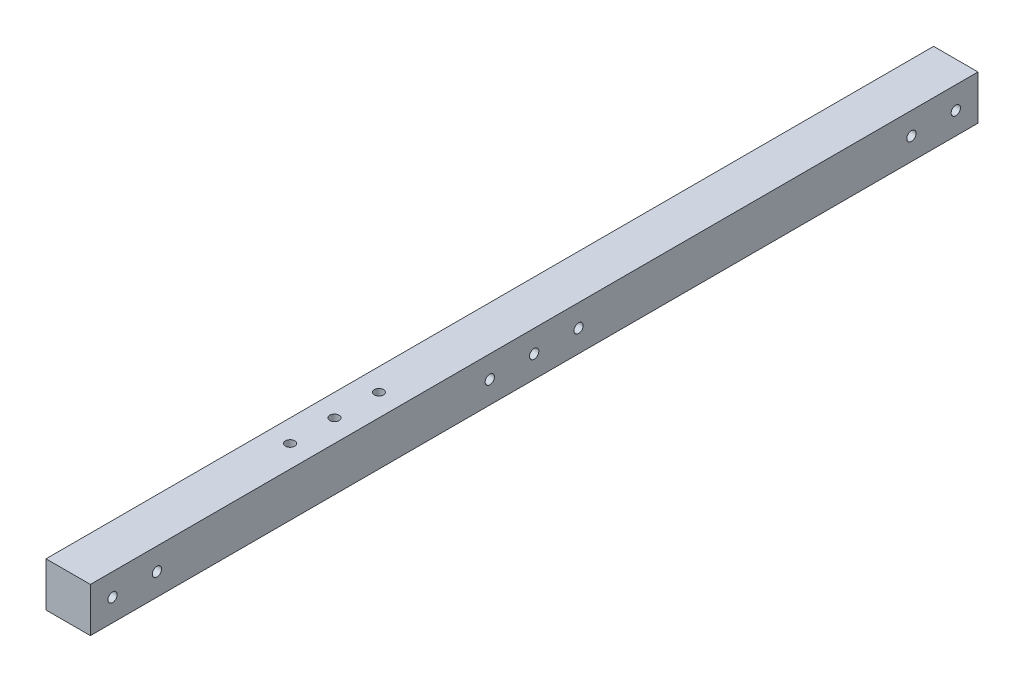
ISO-10303-21;
HEADER;
FILE_DESCRIPTION(('STEP AP214'),'2;1');
FILE_NAME('part.step','',(''),(''),'','','');
FILE_SCHEMA(('AUTOMOTIVE_DESIGN { 1 0 10303 214 1 1 1 1 }'));
ENDSEC;
DATA;
#1=APPLICATION_CONTEXT('core data for automotive mechanical design processes');
#2=APPLICATION_PROTOCOL_DEFINITION('international standard','automotive_design',2000,#1);
#3=PRODUCT_CONTEXT('',#1,'mechanical');
#4=PRODUCT('Part','Part','',(#3));
#5=PRODUCT_RELATED_PRODUCT_CATEGORY('part','',(#4));
#6=PRODUCT_DEFINITION_FORMATION('','',#4);
#7=PRODUCT_DEFINITION_CONTEXT('part definition',#1,'design');
#8=PRODUCT_DEFINITION('design','',#6,#7);
#9=PRODUCT_DEFINITION_SHAPE('','',#8);
#10=(LENGTH_UNIT() NAMED_UNIT(*) SI_UNIT(.MILLI.,.METRE.));
#11=(NAMED_UNIT(*) PLANE_ANGLE_UNIT() SI_UNIT($,.RADIAN.));
#12=(NAMED_UNIT(*) SI_UNIT($,.STERADIAN.) SOLID_ANGLE_UNIT());
#13=UNCERTAINTY_MEASURE_WITH_UNIT(LENGTH_MEASURE(1.E-05),#10,'distance_accuracy_value','');
#14=(GEOMETRIC_REPRESENTATION_CONTEXT(3) GLOBAL_UNCERTAINTY_ASSIGNED_CONTEXT((#13)) GLOBAL_UNIT_ASSIGNED_CONTEXT((#10,
#11,#12)) REPRESENTATION_CONTEXT('',''));
#15=CARTESIAN_POINT('',(0.,0.,0.));
#16=DIRECTION('',(0.,0.,1.));
#17=DIRECTION('',(1.,0.,0.));
#18=AXIS2_PLACEMENT_3D('',#15,#16,#17);
#19=CARTESIAN_POINT('',(10.,10.,400.));
#20=DIRECTION('',(-1.,0.,0.));
#21=DIRECTION('',(0.,0.,1.));
#22=AXIS2_PLACEMENT_3D('',#19,#20,#21);
#23=PLANE('',#22);
#24=CARTESIAN_POINT('',(10.,0.,220.));
#25=DIRECTION('',(1.,0.,0.));
#26=DIRECTION('',(0.,0.,-1.));
#27=AXIS2_PLACEMENT_3D('',#24,#25,#26);
#28=CIRCLE('',#27,2.09999999999999);
#29=CARTESIAN_POINT('',(10.,0.,217.9));
#30=VERTEX_POINT('',#29);
#31=EDGE_CURVE('E177',#30,#30,#28,.T.);
#32=ORIENTED_EDGE('',*,*,#31,.F.);
#33=EDGE_LOOP('',(#32));
#34=FACE_BOUND('',#33,.T.);
#35=CARTESIAN_POINT('',(10.,0.,200.));
#36=DIRECTION('',(1.,0.,0.));
#37=DIRECTION('',(0.,0.,-1.));
#38=AXIS2_PLACEMENT_3D('',#35,#36,#37);
#39=CIRCLE('',#38,2.09999999999999);
#40=CARTESIAN_POINT('',(10.,0.,197.9));
#41=VERTEX_POINT('',#40);
#42=EDGE_CURVE('E169',#41,#41,#39,.T.);
#43=ORIENTED_EDGE('',*,*,#42,.F.);
#44=EDGE_LOOP('',(#43));
#45=FACE_BOUND('',#44,.T.);
#46=CARTESIAN_POINT('',(10.,0.,180.));
#47=DIRECTION('',(1.,0.,0.));
#48=DIRECTION('',(0.,0.,-1.));
#49=AXIS2_PLACEMENT_3D('',#46,#47,#48);
#50=CIRCLE('',#49,2.10000000000002);
#51=CARTESIAN_POINT('',(10.,0.,177.9));
#52=VERTEX_POINT('',#51);
#53=EDGE_CURVE('E160',#52,#52,#50,.T.);
#54=ORIENTED_EDGE('',*,*,#53,.F.);
#55=EDGE_LOOP('',(#54));
#56=FACE_BOUND('',#55,.T.);
#57=CARTESIAN_POINT('',(10.,0.,10.));
#58=DIRECTION('',(1.,0.,0.));
#59=DIRECTION('',(0.,0.,-1.));
#60=AXIS2_PLACEMENT_3D('',#57,#58,#59);
#61=CIRCLE('',#60,2.1);
#62=CARTESIAN_POINT('',(10.,0.,7.9));
#63=VERTEX_POINT('',#62);
#64=EDGE_CURVE('E145',#63,#63,#61,.T.);
#65=ORIENTED_EDGE('',*,*,#64,.F.);
#66=EDGE_LOOP('',(#65));
#67=FACE_BOUND('',#66,.T.);
#68=CARTESIAN_POINT('',(10.,-1.5701111606106E-13,370.));
#69=DIRECTION('',(1.,0.,0.));
#70=DIRECTION('',(0.,0.,1.));
#71=AXIS2_PLACEMENT_3D('',#68,#69,#70);
#72=CIRCLE('',#71,2.09999999999999);
#73=CARTESIAN_POINT('',(10.,-1.5701111606106E-13,372.1));
#74=VERTEX_POINT('',#73);
#75=EDGE_CURVE('E146',#74,#74,#72,.T.);
#76=ORIENTED_EDGE('',*,*,#75,.F.);
#77=EDGE_LOOP('',(#76));
#78=FACE_BOUND('',#77,.T.);
#79=CARTESIAN_POINT('',(10.,-1.39659253553725E-13,30.));
#80=DIRECTION('',(1.,0.,0.));
#81=DIRECTION('',(0.,0.,-1.));
#82=AXIS2_PLACEMENT_3D('',#79,#80,#81);
#83=CIRCLE('',#82,2.1);
#84=CARTESIAN_POINT('',(10.,-1.39659253553725E-13,27.9));
#85=VERTEX_POINT('',#84);
#86=EDGE_CURVE('E128',#85,#85,#83,.T.);
#87=ORIENTED_EDGE('',*,*,#86,.F.);
#88=EDGE_LOOP('',(#87));
#89=FACE_BOUND('',#88,.T.);
#90=CARTESIAN_POINT('',(10.,0.,390.));
#91=DIRECTION('',(1.,0.,0.));
#92=DIRECTION('',(0.,0.,1.));
#93=AXIS2_PLACEMENT_3D('',#90,#91,#92);
#94=CIRCLE('',#93,2.09999999999999);
#95=CARTESIAN_POINT('',(10.,0.,392.1));
#96=VERTEX_POINT('',#95);
#97=EDGE_CURVE('E137',#96,#96,#94,.T.);
#98=ORIENTED_EDGE('',*,*,#97,.F.);
#99=EDGE_LOOP('',(#98));
#100=FACE_BOUND('',#99,.T.);
#101=DIRECTION('',(0.,1.,0.));
#102=VECTOR('',#101,1.);
#103=CARTESIAN_POINT('',(10.,10.,0.));
#104=LINE('',#103,#102);
#105=CARTESIAN_POINT('',(10.,-10.,0.));
#106=VERTEX_POINT('',#105);
#107=CARTESIAN_POINT('',(10.,10.,0.));
#108=VERTEX_POINT('',#107);
#109=EDGE_CURVE('E107',#106,#108,#104,.T.);
#110=ORIENTED_EDGE('',*,*,#109,.T.);
#111=DIRECTION('',(0.,0.,-1.));
#112=VECTOR('',#111,1.);
#113=CARTESIAN_POINT('',(10.,10.,400.));
#114=LINE('',#113,#112);
#115=CARTESIAN_POINT('',(10.,10.,400.));
#116=VERTEX_POINT('',#115);
#117=EDGE_CURVE('E11',#116,#108,#114,.T.);
#118=ORIENTED_EDGE('',*,*,#117,.F.);
#119=DIRECTION('',(0.,1.,0.));
#120=VECTOR('',#119,1.);
#121=CARTESIAN_POINT('',(10.,10.,400.));
#122=LINE('',#121,#120);
#123=CARTESIAN_POINT('',(10.,-10.,400.));
#124=VERTEX_POINT('',#123);
#125=EDGE_CURVE('E91',#124,#116,#122,.T.);
#126=ORIENTED_EDGE('',*,*,#125,.F.);
#127=DIRECTION('',(0.,0.,-1.));
#128=VECTOR('',#127,1.);
#129=CARTESIAN_POINT('',(10.,-10.,400.));
#130=LINE('',#129,#128);
#131=EDGE_CURVE('E103',#124,#106,#130,.T.);
#132=ORIENTED_EDGE('',*,*,#131,.T.);
#133=EDGE_LOOP('',(#110,#118,#126,#132));
#134=FACE_BOUND('',#133,.T.);
#135=ADVANCED_FACE('F39',(#34,#45,#56,#67,#78,#89,#100,#134),#23,.F.);
#136=CARTESIAN_POINT('',(-10.,10.,400.));
#137=DIRECTION('',(0.,-1.,0.));
#138=DIRECTION('',(0.,0.,-1.));
#139=AXIS2_PLACEMENT_3D('',#136,#137,#138);
#140=PLANE('',#139);
#141=CARTESIAN_POINT('',(0.,10.,300.));
#142=DIRECTION('',(0.,-1.,0.));
#143=DIRECTION('',(0.,0.,-1.));
#144=AXIS2_PLACEMENT_3D('',#141,#142,#143);
#145=CIRCLE('',#144,2.09999999999999);
#146=CARTESIAN_POINT('',(0.,10.,297.9));
#147=VERTEX_POINT('',#146);
#148=EDGE_CURVE('E165',#147,#147,#145,.T.);
#149=ORIENTED_EDGE('',*,*,#148,.T.);
#150=EDGE_LOOP('',(#149));
#151=FACE_BOUND('',#150,.T.);
#152=CARTESIAN_POINT('',(2.08264233531441E-13,10.,280.));
#153=DIRECTION('',(0.,-1.,0.));
#154=DIRECTION('',(0.,0.,-1.));
#155=AXIS2_PLACEMENT_3D('',#152,#153,#154);
#156=CIRCLE('',#155,2.09999999999999);
#157=CARTESIAN_POINT('',(2.08264233531441E-13,10.,277.9));
#158=VERTEX_POINT('',#157);
#159=EDGE_CURVE('E196',#158,#158,#156,.T.);
#160=ORIENTED_EDGE('',*,*,#159,.T.);
#161=EDGE_LOOP('',(#160));
#162=FACE_BOUND('',#161,.T.);
#163=CARTESIAN_POINT('',(4.16528467062882E-13,10.,260.));
#164=DIRECTION('',(0.,-1.,0.));
#165=DIRECTION('',(0.,0.,-1.));
#166=AXIS2_PLACEMENT_3D('',#163,#164,#165);
#167=CIRCLE('',#166,2.1);
#168=CARTESIAN_POINT('',(4.16528467062882E-13,10.,257.9));
#169=VERTEX_POINT('',#168);
#170=EDGE_CURVE('E188',#169,#169,#167,.T.);
#171=ORIENTED_EDGE('',*,*,#170,.T.);
#172=EDGE_LOOP('',(#171));
#173=FACE_BOUND('',#172,.T.);
#174=DIRECTION('',(-1.,0.,0.));
#175=VECTOR('',#174,1.);
#176=CARTESIAN_POINT('',(-10.,10.,0.));
#177=LINE('',#176,#175);
#178=CARTESIAN_POINT('',(-10.,10.,0.));
#179=VERTEX_POINT('',#178);
#180=EDGE_CURVE('E96',#108,#179,#177,.T.);
#181=ORIENTED_EDGE('',*,*,#180,.T.);
#182=DIRECTION('',(0.,0.,-1.));
#183=VECTOR('',#182,1.);
#184=CARTESIAN_POINT('',(-10.,10.,400.));
#185=LINE('',#184,#183);
#186=CARTESIAN_POINT('',(-10.,10.,400.));
#187=VERTEX_POINT('',#186);
#188=EDGE_CURVE('E48',#187,#179,#185,.T.);
#189=ORIENTED_EDGE('',*,*,#188,.F.);
#190=DIRECTION('',(-1.,0.,0.));
#191=VECTOR('',#190,1.);
#192=CARTESIAN_POINT('',(-10.,10.,400.));
#193=LINE('',#192,#191);
#194=EDGE_CURVE('E86',#116,#187,#193,.T.);
#195=ORIENTED_EDGE('',*,*,#194,.F.);
#196=ORIENTED_EDGE('',*,*,#117,.T.);
#197=EDGE_LOOP('',(#181,#189,#195,#196));
#198=FACE_BOUND('',#197,.T.);
#199=ADVANCED_FACE('F95',(#151,#162,#173,#198),#140,.F.);
#200=CARTESIAN_POINT('',(-10.,10.,400.));
#201=DIRECTION('',(1.,0.,0.));
#202=DIRECTION('',(0.,1.,0.));
#203=AXIS2_PLACEMENT_3D('',#200,#201,#202);
#204=PLANE('',#203);
#205=CARTESIAN_POINT('',(-10.,0.,220.));
#206=DIRECTION('',(1.,0.,0.));
#207=DIRECTION('',(0.,0.,-1.));
#208=AXIS2_PLACEMENT_3D('',#205,#206,#207);
#209=CIRCLE('',#208,2.09999999999999);
#210=CARTESIAN_POINT('',(-10.,0.,217.9));
#211=VERTEX_POINT('',#210);
#212=EDGE_CURVE('E150',#211,#211,#209,.T.);
#213=ORIENTED_EDGE('',*,*,#212,.T.);
#214=EDGE_LOOP('',(#213));
#215=FACE_BOUND('',#214,.T.);
#216=CARTESIAN_POINT('',(-10.,0.,200.));
#217=DIRECTION('',(1.,0.,0.));
#218=DIRECTION('',(0.,0.,-1.));
#219=AXIS2_PLACEMENT_3D('',#216,#217,#218);
#220=CIRCLE('',#219,2.09999999999999);
#221=CARTESIAN_POINT('',(-10.,0.,197.9));
#222=VERTEX_POINT('',#221);
#223=EDGE_CURVE('E173',#222,#222,#220,.T.);
#224=ORIENTED_EDGE('',*,*,#223,.T.);
#225=EDGE_LOOP('',(#224));
#226=FACE_BOUND('',#225,.T.);
#227=CARTESIAN_POINT('',(-10.,0.,180.));
#228=DIRECTION('',(1.,0.,0.));
#229=DIRECTION('',(0.,0.,-1.));
#230=AXIS2_PLACEMENT_3D('',#227,#228,#229);
#231=CIRCLE('',#230,2.10000000000002);
#232=CARTESIAN_POINT('',(-10.,0.,177.9));
#233=VERTEX_POINT('',#232);
#234=EDGE_CURVE('E164',#233,#233,#231,.T.);
#235=ORIENTED_EDGE('',*,*,#234,.T.);
#236=EDGE_LOOP('',(#235));
#237=FACE_BOUND('',#236,.T.);
#238=CARTESIAN_POINT('',(-10.,0.,10.));
#239=DIRECTION('',(1.,0.,0.));
#240=DIRECTION('',(0.,0.,-1.));
#241=AXIS2_PLACEMENT_3D('',#238,#239,#240);
#242=CIRCLE('',#241,2.1);
#243=CARTESIAN_POINT('',(-10.,0.,7.9));
#244=VERTEX_POINT('',#243);
#245=EDGE_CURVE('E111',#244,#244,#242,.T.);
#246=ORIENTED_EDGE('',*,*,#245,.T.);
#247=EDGE_LOOP('',(#246));
#248=FACE_BOUND('',#247,.T.);
#249=CARTESIAN_POINT('',(-10.,-1.5701111606106E-13,370.));
#250=DIRECTION('',(1.,0.,0.));
#251=DIRECTION('',(0.,0.,1.));
#252=AXIS2_PLACEMENT_3D('',#249,#250,#251);
#253=CIRCLE('',#252,2.09999999999999);
#254=CARTESIAN_POINT('',(-10.,-1.5701111606106E-13,372.1));
#255=VERTEX_POINT('',#254);
#256=EDGE_CURVE('E133',#255,#255,#253,.T.);
#257=ORIENTED_EDGE('',*,*,#256,.T.);
#258=EDGE_LOOP('',(#257));
#259=FACE_BOUND('',#258,.T.);
#260=CARTESIAN_POINT('',(-10.,-1.39659253553725E-13,30.));
#261=DIRECTION('',(1.,0.,0.));
#262=DIRECTION('',(0.,0.,-1.));
#263=AXIS2_PLACEMENT_3D('',#260,#261,#262);
#264=CIRCLE('',#263,2.1);
#265=CARTESIAN_POINT('',(-10.,-1.39659253553725E-13,27.9));
#266=VERTEX_POINT('',#265);
#267=EDGE_CURVE('E132',#266,#266,#264,.T.);
#268=ORIENTED_EDGE('',*,*,#267,.T.);
#269=EDGE_LOOP('',(#268));
#270=FACE_BOUND('',#269,.T.);
#271=CARTESIAN_POINT('',(-10.,0.,390.));
#272=DIRECTION('',(1.,0.,0.));
#273=DIRECTION('',(0.,0.,1.));
#274=AXIS2_PLACEMENT_3D('',#271,#272,#273);
#275=CIRCLE('',#274,2.09999999999999);
#276=CARTESIAN_POINT('',(-10.,0.,392.1));
#277=VERTEX_POINT('',#276);
#278=EDGE_CURVE('E141',#277,#277,#275,.T.);
#279=ORIENTED_EDGE('',*,*,#278,.T.);
#280=EDGE_LOOP('',(#279));
#281=FACE_BOUND('',#280,.T.);
#282=DIRECTION('',(0.,-1.,0.));
#283=VECTOR('',#282,1.);
#284=CARTESIAN_POINT('',(-10.,10.,0.));
#285=LINE('',#284,#283);
#286=CARTESIAN_POINT('',(-10.,-10.,0.));
#287=VERTEX_POINT('',#286);
#288=EDGE_CURVE('E73',#179,#287,#285,.T.);
#289=ORIENTED_EDGE('',*,*,#288,.T.);
#290=DIRECTION('',(0.,0.,-1.));
#291=VECTOR('',#290,1.);
#292=CARTESIAN_POINT('',(-10.,-10.,400.));
#293=LINE('',#292,#291);
#294=CARTESIAN_POINT('',(-10.,-10.,400.));
#295=VERTEX_POINT('',#294);
#296=EDGE_CURVE('E98',#295,#287,#293,.T.);
#297=ORIENTED_EDGE('',*,*,#296,.F.);
#298=DIRECTION('',(0.,-1.,0.));
#299=VECTOR('',#298,1.);
#300=CARTESIAN_POINT('',(-10.,10.,400.));
#301=LINE('',#300,#299);
#302=EDGE_CURVE('E89',#187,#295,#301,.T.);
#303=ORIENTED_EDGE('',*,*,#302,.F.);
#304=ORIENTED_EDGE('',*,*,#188,.T.);
#305=EDGE_LOOP('',(#289,#297,#303,#304));
#306=FACE_BOUND('',#305,.T.);
#307=ADVANCED_FACE('F99',(#215,#226,#237,#248,#259,#270,#281,#306),#204,.F.);
#308=CARTESIAN_POINT('',(-10.,-10.,400.));
#309=DIRECTION('',(0.,1.,0.));
#310=DIRECTION('',(0.,0.,1.));
#311=AXIS2_PLACEMENT_3D('',#308,#309,#310);
#312=PLANE('',#311);
#313=CARTESIAN_POINT('',(0.,-10.,300.));
#314=DIRECTION('',(0.,-1.,0.));
#315=DIRECTION('',(0.,0.,-1.));
#316=AXIS2_PLACEMENT_3D('',#313,#314,#315);
#317=CIRCLE('',#316,2.09999999999999);
#318=CARTESIAN_POINT('',(0.,-10.,297.9));
#319=VERTEX_POINT('',#318);
#320=EDGE_CURVE('E200',#319,#319,#317,.T.);
#321=ORIENTED_EDGE('',*,*,#320,.F.);
#322=EDGE_LOOP('',(#321));
#323=FACE_BOUND('',#322,.T.);
#324=CARTESIAN_POINT('',(2.08264233531441E-13,-10.,280.));
#325=DIRECTION('',(0.,-1.,0.));
#326=DIRECTION('',(0.,0.,-1.));
#327=AXIS2_PLACEMENT_3D('',#324,#325,#326);
#328=CIRCLE('',#327,2.09999999999999);
#329=CARTESIAN_POINT('',(2.08264233531441E-13,-10.,277.9));
#330=VERTEX_POINT('',#329);
#331=EDGE_CURVE('E192',#330,#330,#328,.T.);
#332=ORIENTED_EDGE('',*,*,#331,.F.);
#333=EDGE_LOOP('',(#332));
#334=FACE_BOUND('',#333,.T.);
#335=CARTESIAN_POINT('',(4.16528467062882E-13,-10.,260.));
#336=DIRECTION('',(0.,-1.,0.));
#337=DIRECTION('',(0.,0.,-1.));
#338=AXIS2_PLACEMENT_3D('',#335,#336,#337);
#339=CIRCLE('',#338,2.1);
#340=CARTESIAN_POINT('',(4.16528467062882E-13,-10.,257.9));
#341=VERTEX_POINT('',#340);
#342=EDGE_CURVE('E184',#341,#341,#339,.T.);
#343=ORIENTED_EDGE('',*,*,#342,.F.);
#344=EDGE_LOOP('',(#343));
#345=FACE_BOUND('',#344,.T.);
#346=DIRECTION('',(1.,0.,0.));
#347=VECTOR('',#346,1.);
#348=CARTESIAN_POINT('',(-10.,-10.,0.));
#349=LINE('',#348,#347);
#350=EDGE_CURVE('E79',#287,#106,#349,.T.);
#351=ORIENTED_EDGE('',*,*,#350,.T.);
#352=ORIENTED_EDGE('',*,*,#131,.F.);
#353=DIRECTION('',(1.,0.,0.));
#354=VECTOR('',#353,1.);
#355=CARTESIAN_POINT('',(-10.,-10.,400.));
#356=LINE('',#355,#354);
#357=EDGE_CURVE('E56',#295,#124,#356,.T.);
#358=ORIENTED_EDGE('',*,*,#357,.F.);
#359=ORIENTED_EDGE('',*,*,#296,.T.);
#360=EDGE_LOOP('',(#351,#352,#358,#359));
#361=FACE_BOUND('',#360,.T.);
#362=ADVANCED_FACE('F121',(#323,#334,#345,#361),#312,.F.);
#363=CARTESIAN_POINT('',(0.,0.,400.));
#364=DIRECTION('',(0.,0.,1.));
#365=DIRECTION('',(1.,0.,0.));
#366=AXIS2_PLACEMENT_3D('',#363,#364,#365);
#367=PLANE('',#366);
#368=ORIENTED_EDGE('',*,*,#125,.T.);
#369=ORIENTED_EDGE('',*,*,#194,.T.);
#370=ORIENTED_EDGE('',*,*,#302,.T.);
#371=ORIENTED_EDGE('',*,*,#357,.T.);
#372=EDGE_LOOP('',(#368,#369,#370,#371));
#373=FACE_BOUND('',#372,.T.);
#374=ADVANCED_FACE('F87',(#373),#367,.T.);
#375=CARTESIAN_POINT('',(0.,0.,0.));
#376=DIRECTION('',(0.,0.,1.));
#377=DIRECTION('',(1.,0.,0.));
#378=AXIS2_PLACEMENT_3D('',#375,#376,#377);
#379=PLANE('',#378);
#380=ORIENTED_EDGE('',*,*,#109,.F.);
#381=ORIENTED_EDGE('',*,*,#350,.F.);
#382=ORIENTED_EDGE('',*,*,#288,.F.);
#383=ORIENTED_EDGE('',*,*,#180,.F.);
#384=EDGE_LOOP('',(#380,#381,#382,#383));
#385=FACE_BOUND('',#384,.T.);
#386=ADVANCED_FACE('F124',(#385),#379,.F.);
#387=CARTESIAN_POINT('',(-10.,0.,390.));
#388=DIRECTION('',(1.,0.,0.));
#389=DIRECTION('',(0.,0.,-1.));
#390=AXIS2_PLACEMENT_3D('',#387,#388,#389);
#391=CYLINDRICAL_SURFACE('',#390,2.09999999999999);
#392=ORIENTED_EDGE('',*,*,#278,.F.);
#393=EDGE_LOOP('',(#392));
#394=FACE_BOUND('',#393,.T.);
#395=ORIENTED_EDGE('',*,*,#97,.T.);
#396=EDGE_LOOP('',(#395));
#397=FACE_BOUND('',#396,.T.);
#398=ADVANCED_FACE('F258',(#394,#397),#391,.F.);
#399=CARTESIAN_POINT('',(-10.,-1.39659253553725E-13,30.));
#400=DIRECTION('',(1.,0.,0.));
#401=DIRECTION('',(0.,0.,-1.));
#402=AXIS2_PLACEMENT_3D('',#399,#400,#401);
#403=CYLINDRICAL_SURFACE('',#402,2.1);
#404=ORIENTED_EDGE('',*,*,#267,.F.);
#405=EDGE_LOOP('',(#404));
#406=FACE_BOUND('',#405,.T.);
#407=ORIENTED_EDGE('',*,*,#86,.T.);
#408=EDGE_LOOP('',(#407));
#409=FACE_BOUND('',#408,.T.);
#410=ADVANCED_FACE('F260',(#406,#409),#403,.F.);
#411=CARTESIAN_POINT('',(-10.,-1.5701111606106E-13,370.));
#412=DIRECTION('',(1.,0.,0.));
#413=DIRECTION('',(0.,0.,-1.));
#414=AXIS2_PLACEMENT_3D('',#411,#412,#413);
#415=CYLINDRICAL_SURFACE('',#414,2.09999999999999);
#416=ORIENTED_EDGE('',*,*,#256,.F.);
#417=EDGE_LOOP('',(#416));
#418=FACE_BOUND('',#417,.T.);
#419=ORIENTED_EDGE('',*,*,#75,.T.);
#420=EDGE_LOOP('',(#419));
#421=FACE_BOUND('',#420,.T.);
#422=ADVANCED_FACE('F267',(#418,#421),#415,.F.);
#423=CARTESIAN_POINT('',(-10.,0.,10.));
#424=DIRECTION('',(1.,0.,0.));
#425=DIRECTION('',(0.,0.,-1.));
#426=AXIS2_PLACEMENT_3D('',#423,#424,#425);
#427=CYLINDRICAL_SURFACE('',#426,2.1);
#428=ORIENTED_EDGE('',*,*,#245,.F.);
#429=EDGE_LOOP('',(#428));
#430=FACE_BOUND('',#429,.T.);
#431=ORIENTED_EDGE('',*,*,#64,.T.);
#432=EDGE_LOOP('',(#431));
#433=FACE_BOUND('',#432,.T.);
#434=ADVANCED_FACE('F297',(#430,#433),#427,.F.);
#435=CARTESIAN_POINT('',(-10.,0.,180.));
#436=DIRECTION('',(1.,0.,0.));
#437=DIRECTION('',(0.,0.,-1.));
#438=AXIS2_PLACEMENT_3D('',#435,#436,#437);
#439=CYLINDRICAL_SURFACE('',#438,2.10000000000002);
#440=ORIENTED_EDGE('',*,*,#234,.F.);
#441=EDGE_LOOP('',(#440));
#442=FACE_BOUND('',#441,.T.);
#443=ORIENTED_EDGE('',*,*,#53,.T.);
#444=EDGE_LOOP('',(#443));
#445=FACE_BOUND('',#444,.T.);
#446=ADVANCED_FACE('F301',(#442,#445),#439,.F.);
#447=CARTESIAN_POINT('',(-10.,0.,200.));
#448=DIRECTION('',(1.,0.,0.));
#449=DIRECTION('',(0.,0.,-1.));
#450=AXIS2_PLACEMENT_3D('',#447,#448,#449);
#451=CYLINDRICAL_SURFACE('',#450,2.09999999999999);
#452=ORIENTED_EDGE('',*,*,#223,.F.);
#453=EDGE_LOOP('',(#452));
#454=FACE_BOUND('',#453,.T.);
#455=ORIENTED_EDGE('',*,*,#42,.T.);
#456=EDGE_LOOP('',(#455));
#457=FACE_BOUND('',#456,.T.);
#458=ADVANCED_FACE('F235',(#454,#457),#451,.F.);
#459=CARTESIAN_POINT('',(-10.,0.,220.));
#460=DIRECTION('',(1.,0.,0.));
#461=DIRECTION('',(0.,0.,-1.));
#462=AXIS2_PLACEMENT_3D('',#459,#460,#461);
#463=CYLINDRICAL_SURFACE('',#462,2.09999999999999);
#464=ORIENTED_EDGE('',*,*,#212,.F.);
#465=EDGE_LOOP('',(#464));
#466=FACE_BOUND('',#465,.T.);
#467=ORIENTED_EDGE('',*,*,#31,.T.);
#468=EDGE_LOOP('',(#467));
#469=FACE_BOUND('',#468,.T.);
#470=ADVANCED_FACE('F226',(#466,#469),#463,.F.);
#471=CARTESIAN_POINT('',(4.16528467062882E-13,10.,260.));
#472=DIRECTION('',(0.,-1.,0.));
#473=DIRECTION('',(0.,0.,-1.));
#474=AXIS2_PLACEMENT_3D('',#471,#472,#473);
#475=CYLINDRICAL_SURFACE('',#474,2.1);
#476=ORIENTED_EDGE('',*,*,#170,.F.);
#477=EDGE_LOOP('',(#476));
#478=FACE_BOUND('',#477,.T.);
#479=ORIENTED_EDGE('',*,*,#342,.T.);
#480=EDGE_LOOP('',(#479));
#481=FACE_BOUND('',#480,.T.);
#482=ADVANCED_FACE('F224',(#478,#481),#475,.F.);
#483=CARTESIAN_POINT('',(2.08264233531441E-13,10.,280.));
#484=DIRECTION('',(0.,-1.,0.));
#485=DIRECTION('',(0.,0.,-1.));
#486=AXIS2_PLACEMENT_3D('',#483,#484,#485);
#487=CYLINDRICAL_SURFACE('',#486,2.09999999999999);
#488=ORIENTED_EDGE('',*,*,#159,.F.);
#489=EDGE_LOOP('',(#488));
#490=FACE_BOUND('',#489,.T.);
#491=ORIENTED_EDGE('',*,*,#331,.T.);
#492=EDGE_LOOP('',(#491));
#493=FACE_BOUND('',#492,.T.);
#494=ADVANCED_FACE('F213',(#490,#493),#487,.F.);
#495=CARTESIAN_POINT('',(0.,10.,300.));
#496=DIRECTION('',(0.,-1.,0.));
#497=DIRECTION('',(0.,0.,-1.));
#498=AXIS2_PLACEMENT_3D('',#495,#496,#497);
#499=CYLINDRICAL_SURFACE('',#498,2.09999999999999);
#500=ORIENTED_EDGE('',*,*,#148,.F.);
#501=EDGE_LOOP('',(#500));
#502=FACE_BOUND('',#501,.T.);
#503=ORIENTED_EDGE('',*,*,#320,.T.);
#504=EDGE_LOOP('',(#503));
#505=FACE_BOUND('',#504,.T.);
#506=ADVANCED_FACE('F210',(#502,#505),#499,.F.);
#507=CLOSED_SHELL('',(#135,#199,#307,#362,#374,#386,#398,#410,#422,#434,#446,#458,#470,#482,
#494,#506));
#508=MANIFOLD_SOLID_BREP('B2',#507);
#509=ADVANCED_BREP_SHAPE_REPRESENTATION('',(#18,#508),#14);
#510=SHAPE_DEFINITION_REPRESENTATION(#9,#509);
ENDSEC;
END-ISO-10303-21;
